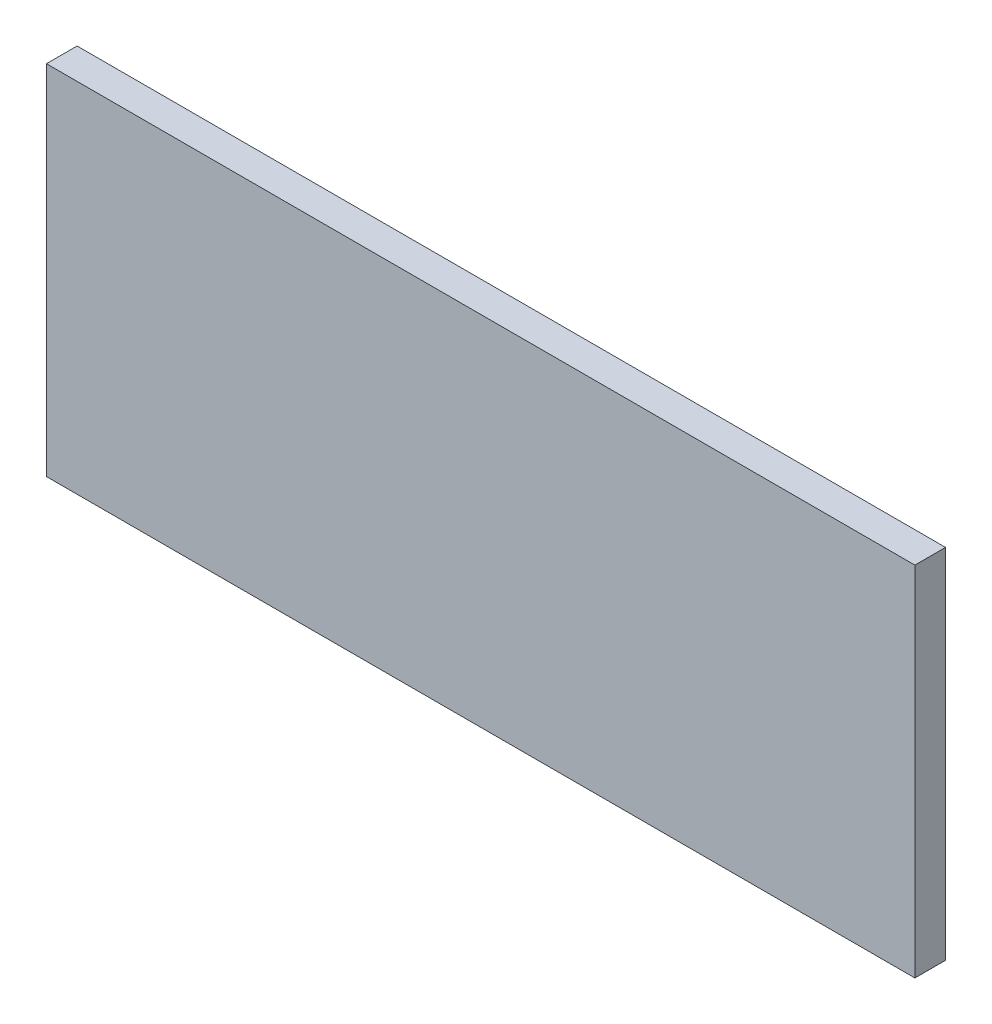
ISO-10303-21;
HEADER;
FILE_DESCRIPTION(('STEP AP214'),'2;1');
FILE_NAME('part.step','',(''),(''),'','','');
FILE_SCHEMA(('AUTOMOTIVE_DESIGN { 1 0 10303 214 1 1 1 1 }'));
ENDSEC;
DATA;
#1=APPLICATION_CONTEXT('core data for automotive mechanical design processes');
#2=APPLICATION_PROTOCOL_DEFINITION('international standard','automotive_design',2000,#1);
#3=PRODUCT_CONTEXT('',#1,'mechanical');
#4=PRODUCT('Part','Part','',(#3));
#5=PRODUCT_RELATED_PRODUCT_CATEGORY('part','',(#4));
#6=PRODUCT_DEFINITION_FORMATION('','',#4);
#7=PRODUCT_DEFINITION_CONTEXT('part definition',#1,'design');
#8=PRODUCT_DEFINITION('design','',#6,#7);
#9=PRODUCT_DEFINITION_SHAPE('','',#8);
#10=(LENGTH_UNIT() NAMED_UNIT(*) SI_UNIT(.MILLI.,.METRE.));
#11=(NAMED_UNIT(*) PLANE_ANGLE_UNIT() SI_UNIT($,.RADIAN.));
#12=(NAMED_UNIT(*) SI_UNIT($,.STERADIAN.) SOLID_ANGLE_UNIT());
#13=UNCERTAINTY_MEASURE_WITH_UNIT(LENGTH_MEASURE(1.E-05),#10,'distance_accuracy_value','');
#14=(GEOMETRIC_REPRESENTATION_CONTEXT(3) GLOBAL_UNCERTAINTY_ASSIGNED_CONTEXT((#13)) GLOBAL_UNIT_ASSIGNED_CONTEXT((#10,
#11,#12)) REPRESENTATION_CONTEXT('',''));
#15=CARTESIAN_POINT('',(0.,0.,0.));
#16=DIRECTION('',(0.,0.,1.));
#17=DIRECTION('',(1.,0.,0.));
#18=AXIS2_PLACEMENT_3D('',#15,#16,#17);
#19=CARTESIAN_POINT('',(-5.,205.,-18.));
#20=DIRECTION('',(-1.,0.,0.));
#21=DIRECTION('',(0.,-1.,0.));
#22=AXIS2_PLACEMENT_3D('',#19,#20,#21);
#23=PLANE('',#22);
#24=DIRECTION('',(0.,-1.,0.));
#25=VECTOR('',#24,1.);
#26=CARTESIAN_POINT('',(-5.,205.,0.));
#27=LINE('',#26,#25);
#28=CARTESIAN_POINT('',(-5.,205.,0.));
#29=VERTEX_POINT('',#28);
#30=CARTESIAN_POINT('',(-4.99999999999997,-5.,0.));
#31=VERTEX_POINT('',#30);
#32=EDGE_CURVE('E103',#29,#31,#27,.T.);
#33=ORIENTED_EDGE('',*,*,#32,.F.);
#34=DIRECTION('',(0.,0.,1.));
#35=VECTOR('',#34,1.);
#36=CARTESIAN_POINT('',(-5.,205.,-18.));
#37=LINE('',#36,#35);
#38=CARTESIAN_POINT('',(-5.,205.,-18.));
#39=VERTEX_POINT('',#38);
#40=EDGE_CURVE('E11',#39,#29,#37,.T.);
#41=ORIENTED_EDGE('',*,*,#40,.F.);
#42=DIRECTION('',(0.,-1.,0.));
#43=VECTOR('',#42,1.);
#44=CARTESIAN_POINT('',(-5.,205.,-18.));
#45=LINE('',#44,#43);
#46=CARTESIAN_POINT('',(-4.99999999999997,-5.,-18.));
#47=VERTEX_POINT('',#46);
#48=EDGE_CURVE('E96',#39,#47,#45,.T.);
#49=ORIENTED_EDGE('',*,*,#48,.T.);
#50=DIRECTION('',(0.,0.,1.));
#51=VECTOR('',#50,1.);
#52=CARTESIAN_POINT('',(-4.99999999999997,-5.,-18.));
#53=LINE('',#52,#51);
#54=EDGE_CURVE('E40',#47,#31,#53,.T.);
#55=ORIENTED_EDGE('',*,*,#54,.T.);
#56=EDGE_LOOP('',(#33,#41,#49,#55));
#57=FACE_BOUND('',#56,.T.);
#58=ADVANCED_FACE('F37',(#57),#23,.T.);
#59=CARTESIAN_POINT('',(-5.,205.,-18.));
#60=DIRECTION('',(0.,1.,0.));
#61=DIRECTION('',(0.,0.,1.));
#62=AXIS2_PLACEMENT_3D('',#59,#60,#61);
#63=PLANE('',#62);
#64=DIRECTION('',(-1.,0.,0.));
#65=VECTOR('',#64,1.);
#66=CARTESIAN_POINT('',(-5.,205.,0.));
#67=LINE('',#66,#65);
#68=CARTESIAN_POINT('',(505.,205.,0.));
#69=VERTEX_POINT('',#68);
#70=EDGE_CURVE('E99',#69,#29,#67,.T.);
#71=ORIENTED_EDGE('',*,*,#70,.F.);
#72=DIRECTION('',(0.,0.,1.));
#73=VECTOR('',#72,1.);
#74=CARTESIAN_POINT('',(505.,205.,-18.));
#75=LINE('',#74,#73);
#76=CARTESIAN_POINT('',(505.,205.,-18.));
#77=VERTEX_POINT('',#76);
#78=EDGE_CURVE('E46',#77,#69,#75,.T.);
#79=ORIENTED_EDGE('',*,*,#78,.F.);
#80=DIRECTION('',(-1.,0.,0.));
#81=VECTOR('',#80,1.);
#82=CARTESIAN_POINT('',(-5.,205.,-18.));
#83=LINE('',#82,#81);
#84=EDGE_CURVE('E92',#77,#39,#83,.T.);
#85=ORIENTED_EDGE('',*,*,#84,.T.);
#86=ORIENTED_EDGE('',*,*,#40,.T.);
#87=EDGE_LOOP('',(#71,#79,#85,#86));
#88=FACE_BOUND('',#87,.T.);
#89=ADVANCED_FACE('F113',(#88),#63,.T.);
#90=CARTESIAN_POINT('',(505.,205.,-18.));
#91=DIRECTION('',(1.,0.,0.));
#92=DIRECTION('',(0.,0.,-1.));
#93=AXIS2_PLACEMENT_3D('',#90,#91,#92);
#94=PLANE('',#93);
#95=DIRECTION('',(0.,1.,0.));
#96=VECTOR('',#95,1.);
#97=CARTESIAN_POINT('',(505.,205.,0.));
#98=LINE('',#97,#96);
#99=CARTESIAN_POINT('',(505.,-5.,0.));
#100=VERTEX_POINT('',#99);
#101=EDGE_CURVE('E87',#100,#69,#98,.T.);
#102=ORIENTED_EDGE('',*,*,#101,.F.);
#103=DIRECTION('',(0.,0.,1.));
#104=VECTOR('',#103,1.);
#105=CARTESIAN_POINT('',(505.,-5.,-18.));
#106=LINE('',#105,#104);
#107=CARTESIAN_POINT('',(505.,-5.,-18.));
#108=VERTEX_POINT('',#107);
#109=EDGE_CURVE('E82',#108,#100,#106,.T.);
#110=ORIENTED_EDGE('',*,*,#109,.F.);
#111=DIRECTION('',(0.,1.,0.));
#112=VECTOR('',#111,1.);
#113=CARTESIAN_POINT('',(505.,205.,-18.));
#114=LINE('',#113,#112);
#115=EDGE_CURVE('E85',#108,#77,#114,.T.);
#116=ORIENTED_EDGE('',*,*,#115,.T.);
#117=ORIENTED_EDGE('',*,*,#78,.T.);
#118=EDGE_LOOP('',(#102,#110,#116,#117));
#119=FACE_BOUND('',#118,.T.);
#120=ADVANCED_FACE('F84',(#119),#94,.T.);
#121=CARTESIAN_POINT('',(-4.99999999999997,-5.,-18.));
#122=DIRECTION('',(0.,-1.,0.));
#123=DIRECTION('',(0.,0.,-1.));
#124=AXIS2_PLACEMENT_3D('',#121,#122,#123);
#125=PLANE('',#124);
#126=DIRECTION('',(1.,0.,0.));
#127=VECTOR('',#126,1.);
#128=CARTESIAN_POINT('',(-4.99999999999997,-5.,0.));
#129=LINE('',#128,#127);
#130=EDGE_CURVE('E106',#31,#100,#129,.T.);
#131=ORIENTED_EDGE('',*,*,#130,.F.);
#132=ORIENTED_EDGE('',*,*,#54,.F.);
#133=DIRECTION('',(1.,0.,0.));
#134=VECTOR('',#133,1.);
#135=CARTESIAN_POINT('',(-4.99999999999997,-5.,-18.));
#136=LINE('',#135,#134);
#137=EDGE_CURVE('E91',#47,#108,#136,.T.);
#138=ORIENTED_EDGE('',*,*,#137,.T.);
#139=ORIENTED_EDGE('',*,*,#109,.T.);
#140=EDGE_LOOP('',(#131,#132,#138,#139));
#141=FACE_BOUND('',#140,.T.);
#142=ADVANCED_FACE('F94',(#141),#125,.T.);
#143=CARTESIAN_POINT('',(0.,0.,-18.));
#144=DIRECTION('',(0.,0.,1.));
#145=DIRECTION('',(1.,0.,0.));
#146=AXIS2_PLACEMENT_3D('',#143,#144,#145);
#147=PLANE('',#146);
#148=ORIENTED_EDGE('',*,*,#48,.F.);
#149=ORIENTED_EDGE('',*,*,#84,.F.);
#150=ORIENTED_EDGE('',*,*,#115,.F.);
#151=ORIENTED_EDGE('',*,*,#137,.F.);
#152=EDGE_LOOP('',(#148,#149,#150,#151));
#153=FACE_BOUND('',#152,.T.);
#154=ADVANCED_FACE('F90',(#153),#147,.F.);
#155=CARTESIAN_POINT('',(0.,0.,0.));
#156=DIRECTION('',(0.,0.,1.));
#157=DIRECTION('',(1.,0.,0.));
#158=AXIS2_PLACEMENT_3D('',#155,#156,#157);
#159=PLANE('',#158);
#160=ORIENTED_EDGE('',*,*,#32,.T.);
#161=ORIENTED_EDGE('',*,*,#130,.T.);
#162=ORIENTED_EDGE('',*,*,#101,.T.);
#163=ORIENTED_EDGE('',*,*,#70,.T.);
#164=EDGE_LOOP('',(#160,#161,#162,#163));
#165=FACE_BOUND('',#164,.T.);
#166=ADVANCED_FACE('F112',(#165),#159,.T.);
#167=CLOSED_SHELL('',(#58,#89,#120,#142,#154,#166));
#168=MANIFOLD_SOLID_BREP('B2',#167);
#169=ADVANCED_BREP_SHAPE_REPRESENTATION('',(#18,#168),#14);
#170=SHAPE_DEFINITION_REPRESENTATION(#9,#169);
ENDSEC;
END-ISO-10303-21;
